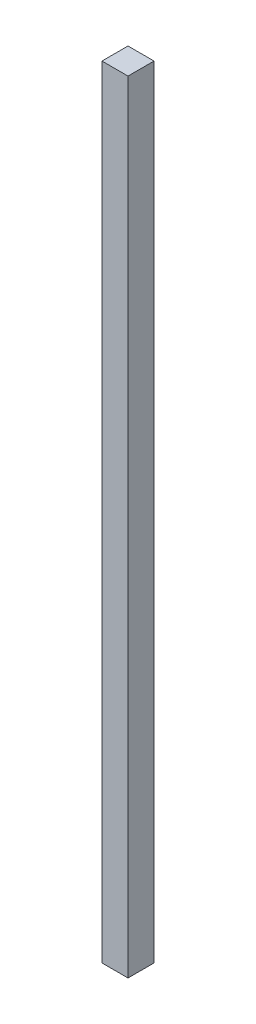
ISO-10303-21;
HEADER;
FILE_DESCRIPTION(('STEP AP214'),'2;1');
FILE_NAME('part.step','',(''),(''),'','','');
FILE_SCHEMA(('AUTOMOTIVE_DESIGN { 1 0 10303 214 1 1 1 1 }'));
ENDSEC;
DATA;
#1=APPLICATION_CONTEXT('core data for automotive mechanical design processes');
#2=APPLICATION_PROTOCOL_DEFINITION('international standard','automotive_design',2000,#1);
#3=PRODUCT_CONTEXT('',#1,'mechanical');
#4=PRODUCT('Part','Part','',(#3));
#5=PRODUCT_RELATED_PRODUCT_CATEGORY('part','',(#4));
#6=PRODUCT_DEFINITION_FORMATION('','',#4);
#7=PRODUCT_DEFINITION_CONTEXT('part definition',#1,'design');
#8=PRODUCT_DEFINITION('design','',#6,#7);
#9=PRODUCT_DEFINITION_SHAPE('','',#8);
#10=(LENGTH_UNIT() NAMED_UNIT(*) SI_UNIT(.MILLI.,.METRE.));
#11=(NAMED_UNIT(*) PLANE_ANGLE_UNIT() SI_UNIT($,.RADIAN.));
#12=(NAMED_UNIT(*) SI_UNIT($,.STERADIAN.) SOLID_ANGLE_UNIT());
#13=UNCERTAINTY_MEASURE_WITH_UNIT(LENGTH_MEASURE(1.E-05),#10,'distance_accuracy_value','');
#14=(GEOMETRIC_REPRESENTATION_CONTEXT(3) GLOBAL_UNCERTAINTY_ASSIGNED_CONTEXT((#13)) GLOBAL_UNIT_ASSIGNED_CONTEXT((#10,
#11,#12)) REPRESENTATION_CONTEXT('',''));
#15=CARTESIAN_POINT('',(0.,0.,0.));
#16=DIRECTION('',(0.,0.,1.));
#17=DIRECTION('',(1.,0.,0.));
#18=AXIS2_PLACEMENT_3D('',#15,#16,#17);
#19=CARTESIAN_POINT('',(25.,1500.,25.));
#20=DIRECTION('',(-1.,0.,0.));
#21=DIRECTION('',(0.,0.,1.));
#22=AXIS2_PLACEMENT_3D('',#19,#20,#21);
#23=PLANE('',#22);
#24=DIRECTION('',(0.,0.,-1.));
#25=VECTOR('',#24,1.);
#26=CARTESIAN_POINT('',(25.,0.,25.));
#27=LINE('',#26,#25);
#28=CARTESIAN_POINT('',(25.,0.,25.));
#29=VERTEX_POINT('',#28);
#30=CARTESIAN_POINT('',(25.,0.,-25.));
#31=VERTEX_POINT('',#30);
#32=EDGE_CURVE('E99',#29,#31,#27,.T.);
#33=ORIENTED_EDGE('',*,*,#32,.T.);
#34=DIRECTION('',(0.,-1.,0.));
#35=VECTOR('',#34,1.);
#36=CARTESIAN_POINT('',(25.,1500.,-25.));
#37=LINE('',#36,#35);
#38=CARTESIAN_POINT('',(25.,1500.,-25.));
#39=VERTEX_POINT('',#38);
#40=EDGE_CURVE('E11',#39,#31,#37,.T.);
#41=ORIENTED_EDGE('',*,*,#40,.F.);
#42=DIRECTION('',(0.,0.,-1.));
#43=VECTOR('',#42,1.);
#44=CARTESIAN_POINT('',(25.,1500.,25.));
#45=LINE('',#44,#43);
#46=CARTESIAN_POINT('',(25.,1500.,25.));
#47=VERTEX_POINT('',#46);
#48=EDGE_CURVE('E87',#47,#39,#45,.T.);
#49=ORIENTED_EDGE('',*,*,#48,.F.);
#50=DIRECTION('',(0.,-1.,0.));
#51=VECTOR('',#50,1.);
#52=CARTESIAN_POINT('',(25.,1500.,25.));
#53=LINE('',#52,#51);
#54=EDGE_CURVE('E95',#47,#29,#53,.T.);
#55=ORIENTED_EDGE('',*,*,#54,.T.);
#56=EDGE_LOOP('',(#33,#41,#49,#55));
#57=FACE_BOUND('',#56,.T.);
#58=ADVANCED_FACE('F36',(#57),#23,.F.);
#59=CARTESIAN_POINT('',(-25.,1500.,-25.));
#60=DIRECTION('',(0.,0.,1.));
#61=DIRECTION('',(1.,0.,0.));
#62=AXIS2_PLACEMENT_3D('',#59,#60,#61);
#63=PLANE('',#62);
#64=DIRECTION('',(-1.,0.,0.));
#65=VECTOR('',#64,1.);
#66=CARTESIAN_POINT('',(-25.,0.,-25.));
#67=LINE('',#66,#65);
#68=CARTESIAN_POINT('',(-25.,0.,-25.));
#69=VERTEX_POINT('',#68);
#70=EDGE_CURVE('E91',#31,#69,#67,.T.);
#71=ORIENTED_EDGE('',*,*,#70,.T.);
#72=DIRECTION('',(0.,-1.,0.));
#73=VECTOR('',#72,1.);
#74=CARTESIAN_POINT('',(-25.,1500.,-25.));
#75=LINE('',#74,#73);
#76=CARTESIAN_POINT('',(-25.,1500.,-25.));
#77=VERTEX_POINT('',#76);
#78=EDGE_CURVE('E44',#77,#69,#75,.T.);
#79=ORIENTED_EDGE('',*,*,#78,.F.);
#80=DIRECTION('',(-1.,0.,0.));
#81=VECTOR('',#80,1.);
#82=CARTESIAN_POINT('',(-25.,1500.,-25.));
#83=LINE('',#82,#81);
#84=EDGE_CURVE('E82',#39,#77,#83,.T.);
#85=ORIENTED_EDGE('',*,*,#84,.F.);
#86=ORIENTED_EDGE('',*,*,#40,.T.);
#87=EDGE_LOOP('',(#71,#79,#85,#86));
#88=FACE_BOUND('',#87,.T.);
#89=ADVANCED_FACE('F90',(#88),#63,.F.);
#90=CARTESIAN_POINT('',(-25.,1500.,25.));
#91=DIRECTION('',(1.,0.,0.));
#92=DIRECTION('',(0.,0.,-1.));
#93=AXIS2_PLACEMENT_3D('',#90,#91,#92);
#94=PLANE('',#93);
#95=DIRECTION('',(0.,0.,1.));
#96=VECTOR('',#95,1.);
#97=CARTESIAN_POINT('',(-25.,0.,25.));
#98=LINE('',#97,#96);
#99=CARTESIAN_POINT('',(-25.,0.,25.));
#100=VERTEX_POINT('',#99);
#101=EDGE_CURVE('E69',#69,#100,#98,.T.);
#102=ORIENTED_EDGE('',*,*,#101,.T.);
#103=DIRECTION('',(0.,-1.,0.));
#104=VECTOR('',#103,1.);
#105=CARTESIAN_POINT('',(-25.,1500.,25.));
#106=LINE('',#105,#104);
#107=CARTESIAN_POINT('',(-25.,1500.,25.));
#108=VERTEX_POINT('',#107);
#109=EDGE_CURVE('E92',#108,#100,#106,.T.);
#110=ORIENTED_EDGE('',*,*,#109,.F.);
#111=DIRECTION('',(0.,0.,1.));
#112=VECTOR('',#111,1.);
#113=CARTESIAN_POINT('',(-25.,1500.,25.));
#114=LINE('',#113,#112);
#115=EDGE_CURVE('E85',#77,#108,#114,.T.);
#116=ORIENTED_EDGE('',*,*,#115,.F.);
#117=ORIENTED_EDGE('',*,*,#78,.T.);
#118=EDGE_LOOP('',(#102,#110,#116,#117));
#119=FACE_BOUND('',#118,.T.);
#120=ADVANCED_FACE('F93',(#119),#94,.F.);
#121=CARTESIAN_POINT('',(-25.,1500.,25.));
#122=DIRECTION('',(0.,0.,-1.));
#123=DIRECTION('',(-1.,0.,0.));
#124=AXIS2_PLACEMENT_3D('',#121,#122,#123);
#125=PLANE('',#124);
#126=DIRECTION('',(1.,0.,0.));
#127=VECTOR('',#126,1.);
#128=CARTESIAN_POINT('',(-25.,0.,25.));
#129=LINE('',#128,#127);
#130=EDGE_CURVE('E75',#100,#29,#129,.T.);
#131=ORIENTED_EDGE('',*,*,#130,.T.);
#132=ORIENTED_EDGE('',*,*,#54,.F.);
#133=DIRECTION('',(1.,0.,0.));
#134=VECTOR('',#133,1.);
#135=CARTESIAN_POINT('',(-25.,1500.,25.));
#136=LINE('',#135,#134);
#137=EDGE_CURVE('E52',#108,#47,#136,.T.);
#138=ORIENTED_EDGE('',*,*,#137,.F.);
#139=ORIENTED_EDGE('',*,*,#109,.T.);
#140=EDGE_LOOP('',(#131,#132,#138,#139));
#141=FACE_BOUND('',#140,.T.);
#142=ADVANCED_FACE('F106',(#141),#125,.F.);
#143=CARTESIAN_POINT('',(0.,1500.,0.));
#144=DIRECTION('',(0.,-1.,0.));
#145=DIRECTION('',(0.,0.,-1.));
#146=AXIS2_PLACEMENT_3D('',#143,#144,#145);
#147=PLANE('',#146);
#148=ORIENTED_EDGE('',*,*,#48,.T.);
#149=ORIENTED_EDGE('',*,*,#84,.T.);
#150=ORIENTED_EDGE('',*,*,#115,.T.);
#151=ORIENTED_EDGE('',*,*,#137,.T.);
#152=EDGE_LOOP('',(#148,#149,#150,#151));
#153=FACE_BOUND('',#152,.T.);
#154=ADVANCED_FACE('F83',(#153),#147,.F.);
#155=CARTESIAN_POINT('',(0.,0.,0.));
#156=DIRECTION('',(0.,-1.,0.));
#157=DIRECTION('',(0.,0.,-1.));
#158=AXIS2_PLACEMENT_3D('',#155,#156,#157);
#159=PLANE('',#158);
#160=ORIENTED_EDGE('',*,*,#32,.F.);
#161=ORIENTED_EDGE('',*,*,#130,.F.);
#162=ORIENTED_EDGE('',*,*,#101,.F.);
#163=ORIENTED_EDGE('',*,*,#70,.F.);
#164=EDGE_LOOP('',(#160,#161,#162,#163));
#165=FACE_BOUND('',#164,.T.);
#166=ADVANCED_FACE('F109',(#165),#159,.T.);
#167=CLOSED_SHELL('',(#58,#89,#120,#142,#154,#166));
#168=MANIFOLD_SOLID_BREP('B2',#167);
#169=ADVANCED_BREP_SHAPE_REPRESENTATION('',(#18,#168),#14);
#170=SHAPE_DEFINITION_REPRESENTATION(#9,#169);
ENDSEC;
END-ISO-10303-21;
